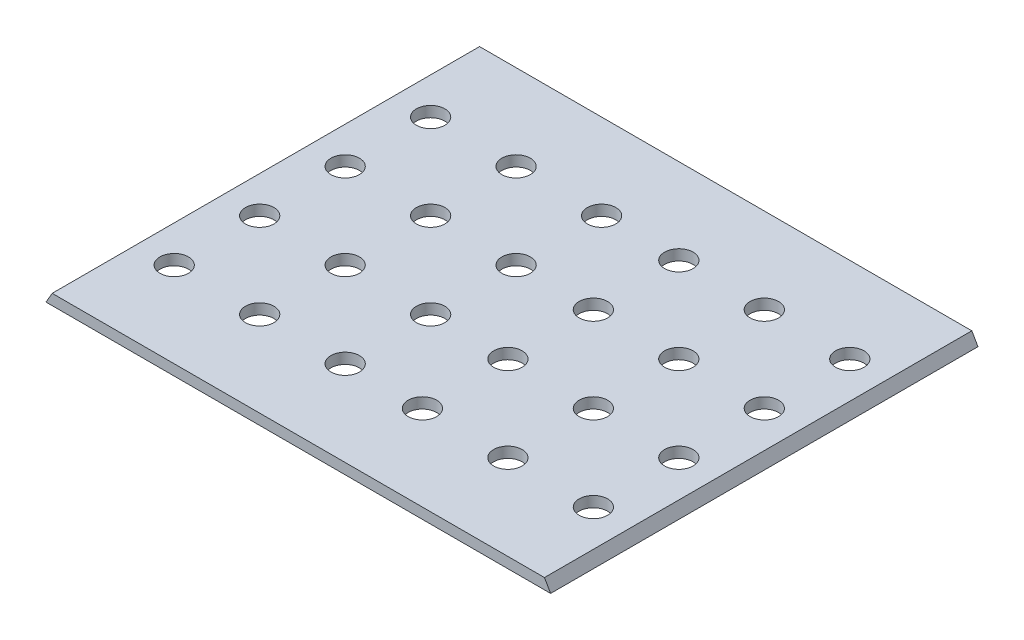
ISO-10303-21;
HEADER;
FILE_DESCRIPTION(('STEP AP214'),'2;1');
FILE_NAME('part.step','',(''),(''),'','','');
FILE_SCHEMA(('AUTOMOTIVE_DESIGN { 1 0 10303 214 1 1 1 1 }'));
ENDSEC;
DATA;
#1=APPLICATION_CONTEXT('core data for automotive mechanical design processes');
#2=APPLICATION_PROTOCOL_DEFINITION('international standard','automotive_design',2000,#1);
#3=PRODUCT_CONTEXT('',#1,'mechanical');
#4=PRODUCT('Part','Part','',(#3));
#5=PRODUCT_RELATED_PRODUCT_CATEGORY('part','',(#4));
#6=PRODUCT_DEFINITION_FORMATION('','',#4);
#7=PRODUCT_DEFINITION_CONTEXT('part definition',#1,'design');
#8=PRODUCT_DEFINITION('design','',#6,#7);
#9=PRODUCT_DEFINITION_SHAPE('','',#8);
#10=(LENGTH_UNIT() NAMED_UNIT(*) SI_UNIT(.MILLI.,.METRE.));
#11=(NAMED_UNIT(*) PLANE_ANGLE_UNIT() SI_UNIT($,.RADIAN.));
#12=(NAMED_UNIT(*) SI_UNIT($,.STERADIAN.) SOLID_ANGLE_UNIT());
#13=UNCERTAINTY_MEASURE_WITH_UNIT(LENGTH_MEASURE(1.E-05),#10,'distance_accuracy_value','');
#14=(GEOMETRIC_REPRESENTATION_CONTEXT(3) GLOBAL_UNCERTAINTY_ASSIGNED_CONTEXT((#13)) GLOBAL_UNIT_ASSIGNED_CONTEXT((#10,
#11,#12)) REPRESENTATION_CONTEXT('',''));
#15=CARTESIAN_POINT('',(0.,0.,0.));
#16=DIRECTION('',(0.,0.,1.));
#17=DIRECTION('',(1.,0.,0.));
#18=AXIS2_PLACEMENT_3D('',#15,#16,#17);
#19=CARTESIAN_POINT('',(0.,7.5,0.));
#20=DIRECTION('',(0.,-1.,0.));
#21=DIRECTION('',(0.,0.,-1.));
#22=AXIS2_PLACEMENT_3D('',#19,#20,#21);
#23=PLANE('',#22);
#24=CARTESIAN_POINT('',(87.1132486540518,7.5,30.));
#25=DIRECTION('',(0.,1.,0.));
#26=DIRECTION('',(0.,0.,1.));
#27=AXIS2_PLACEMENT_3D('',#24,#25,#26);
#28=CIRCLE('',#27,9.99999999999998);
#29=CARTESIAN_POINT('',(87.1132486540518,7.5,40.));
#30=VERTEX_POINT('',#29);
#31=EDGE_CURVE('E316',#30,#30,#28,.T.);
#32=ORIENTED_EDGE('',*,*,#31,.F.);
#33=EDGE_LOOP('',(#32));
#34=FACE_BOUND('',#33,.T.);
#35=CARTESIAN_POINT('',(87.1132486540518,7.5,-30.));
#36=DIRECTION('',(0.,1.,0.));
#37=DIRECTION('',(0.,0.,1.));
#38=AXIS2_PLACEMENT_3D('',#35,#36,#37);
#39=CIRCLE('',#38,9.99999999999998);
#40=CARTESIAN_POINT('',(87.1132486540518,7.5,-20.));
#41=VERTEX_POINT('',#40);
#42=EDGE_CURVE('E322',#41,#41,#39,.T.);
#43=ORIENTED_EDGE('',*,*,#42,.F.);
#44=EDGE_LOOP('',(#43));
#45=FACE_BOUND('',#44,.T.);
#46=CARTESIAN_POINT('',(87.1132486540518,7.5,-90.));
#47=DIRECTION('',(0.,1.,0.));
#48=DIRECTION('',(0.,0.,1.));
#49=AXIS2_PLACEMENT_3D('',#46,#47,#48);
#50=CIRCLE('',#49,9.99999999999998);
#51=CARTESIAN_POINT('',(87.1132486540518,7.5,-80.));
#52=VERTEX_POINT('',#51);
#53=EDGE_CURVE('E328',#52,#52,#50,.T.);
#54=ORIENTED_EDGE('',*,*,#53,.F.);
#55=EDGE_LOOP('',(#54));
#56=FACE_BOUND('',#55,.T.);
#57=CARTESIAN_POINT('',(87.1132486540518,7.5,90.));
#58=DIRECTION('',(0.,1.,0.));
#59=DIRECTION('',(0.,0.,1.));
#60=AXIS2_PLACEMENT_3D('',#57,#58,#59);
#61=CIRCLE('',#60,9.99999999999998);
#62=CARTESIAN_POINT('',(87.1132486540518,7.5,100.));
#63=VERTEX_POINT('',#62);
#64=EDGE_CURVE('E334',#63,#63,#61,.T.);
#65=ORIENTED_EDGE('',*,*,#64,.F.);
#66=EDGE_LOOP('',(#65));
#67=FACE_BOUND('',#66,.T.);
#68=CARTESIAN_POINT('',(147.113248654052,7.5,-30.));
#69=DIRECTION('',(0.,1.,0.));
#70=DIRECTION('',(0.,0.,1.));
#71=AXIS2_PLACEMENT_3D('',#68,#69,#70);
#72=CIRCLE('',#71,9.99999999999998);
#73=CARTESIAN_POINT('',(147.113248654052,7.5,-20.));
#74=VERTEX_POINT('',#73);
#75=EDGE_CURVE('E340',#74,#74,#72,.T.);
#76=ORIENTED_EDGE('',*,*,#75,.F.);
#77=EDGE_LOOP('',(#76));
#78=FACE_BOUND('',#77,.T.);
#79=CARTESIAN_POINT('',(147.113248654052,7.5,-90.));
#80=DIRECTION('',(0.,1.,0.));
#81=DIRECTION('',(0.,0.,1.));
#82=AXIS2_PLACEMENT_3D('',#79,#80,#81);
#83=CIRCLE('',#82,9.99999999999998);
#84=CARTESIAN_POINT('',(147.113248654052,7.5,-80.));
#85=VERTEX_POINT('',#84);
#86=EDGE_CURVE('E343',#85,#85,#83,.T.);
#87=ORIENTED_EDGE('',*,*,#86,.F.);
#88=EDGE_LOOP('',(#87));
#89=FACE_BOUND('',#88,.T.);
#90=DIRECTION('',(-1.,0.,0.));
#91=VECTOR('',#90,1.);
#92=CARTESIAN_POINT('',(0.,7.5,-150.));
#93=LINE('',#92,#91);
#94=CARTESIAN_POINT('',(172.783121635129,7.5,-150.));
#95=VERTEX_POINT('',#94);
#96=CARTESIAN_POINT('',(-172.783121635129,7.5,-150.));
#97=VERTEX_POINT('',#96);
#98=EDGE_CURVE('E81',#95,#97,#93,.T.);
#99=ORIENTED_EDGE('',*,*,#98,.T.);
#100=DIRECTION('',(0.,0.,1.));
#101=VECTOR('',#100,1.);
#102=CARTESIAN_POINT('',(-172.78312163513,7.5,150.));
#103=LINE('',#102,#101);
#104=CARTESIAN_POINT('',(-172.783121635129,7.5,150.));
#105=VERTEX_POINT('',#104);
#106=EDGE_CURVE('E41',#97,#105,#103,.T.);
#107=ORIENTED_EDGE('',*,*,#106,.T.);
#108=DIRECTION('',(1.,0.,0.));
#109=VECTOR('',#108,1.);
#110=CARTESIAN_POINT('',(0.,7.5,150.));
#111=LINE('',#110,#109);
#112=CARTESIAN_POINT('',(172.783121635129,7.5,150.));
#113=VERTEX_POINT('',#112);
#114=EDGE_CURVE('E75',#105,#113,#111,.T.);
#115=ORIENTED_EDGE('',*,*,#114,.T.);
#116=DIRECTION('',(0.,0.,-1.));
#117=VECTOR('',#116,1.);
#118=CARTESIAN_POINT('',(172.78312163513,7.5,0.));
#119=LINE('',#118,#117);
#120=EDGE_CURVE('E79',#113,#95,#119,.T.);
#121=ORIENTED_EDGE('',*,*,#120,.T.);
#122=EDGE_LOOP('',(#99,#107,#115,#121));
#123=FACE_BOUND('',#122,.T.);
#124=CARTESIAN_POINT('',(147.113248654052,7.5,30.));
#125=DIRECTION('',(0.,1.,0.));
#126=DIRECTION('',(0.,0.,1.));
#127=AXIS2_PLACEMENT_3D('',#124,#125,#126);
#128=CIRCLE('',#127,9.99999999999998);
#129=CARTESIAN_POINT('',(147.113248654052,7.5,40.));
#130=VERTEX_POINT('',#129);
#131=EDGE_CURVE('E106',#130,#130,#128,.T.);
#132=ORIENTED_EDGE('',*,*,#131,.F.);
#133=EDGE_LOOP('',(#132));
#134=FACE_BOUND('',#133,.T.);
#135=CARTESIAN_POINT('',(147.113248654052,7.5,90.));
#136=DIRECTION('',(0.,1.,0.));
#137=DIRECTION('',(0.,0.,1.));
#138=AXIS2_PLACEMENT_3D('',#135,#136,#137);
#139=CIRCLE('',#138,9.99999999999998);
#140=CARTESIAN_POINT('',(147.113248654052,7.5,100.));
#141=VERTEX_POINT('',#140);
#142=EDGE_CURVE('E112',#141,#141,#139,.T.);
#143=ORIENTED_EDGE('',*,*,#142,.F.);
#144=EDGE_LOOP('',(#143));
#145=FACE_BOUND('',#144,.T.);
#146=CARTESIAN_POINT('',(27.1132486540518,7.5,90.));
#147=DIRECTION('',(0.,1.,0.));
#148=DIRECTION('',(0.,0.,1.));
#149=AXIS2_PLACEMENT_3D('',#146,#147,#148);
#150=CIRCLE('',#149,9.99999999999998);
#151=CARTESIAN_POINT('',(27.1132486540518,7.5,99.9999999999999));
#152=VERTEX_POINT('',#151);
#153=EDGE_CURVE('E118',#152,#152,#150,.T.);
#154=ORIENTED_EDGE('',*,*,#153,.F.);
#155=EDGE_LOOP('',(#154));
#156=FACE_BOUND('',#155,.T.);
#157=CARTESIAN_POINT('',(27.1132486540518,7.5,-90.));
#158=DIRECTION('',(0.,1.,0.));
#159=DIRECTION('',(0.,0.,1.));
#160=AXIS2_PLACEMENT_3D('',#157,#158,#159);
#161=CIRCLE('',#160,9.99999999999998);
#162=CARTESIAN_POINT('',(27.1132486540518,7.5,-80.));
#163=VERTEX_POINT('',#162);
#164=EDGE_CURVE('E124',#163,#163,#161,.T.);
#165=ORIENTED_EDGE('',*,*,#164,.F.);
#166=EDGE_LOOP('',(#165));
#167=FACE_BOUND('',#166,.T.);
#168=CARTESIAN_POINT('',(27.1132486540518,7.5,-30.));
#169=DIRECTION('',(0.,1.,0.));
#170=DIRECTION('',(0.,0.,1.));
#171=AXIS2_PLACEMENT_3D('',#168,#169,#170);
#172=CIRCLE('',#171,9.99999999999998);
#173=CARTESIAN_POINT('',(27.1132486540518,7.5,-20.0000000000001));
#174=VERTEX_POINT('',#173);
#175=EDGE_CURVE('E130',#174,#174,#172,.T.);
#176=ORIENTED_EDGE('',*,*,#175,.F.);
#177=EDGE_LOOP('',(#176));
#178=FACE_BOUND('',#177,.T.);
#179=CARTESIAN_POINT('',(27.1132486540518,7.5,30.));
#180=DIRECTION('',(0.,1.,0.));
#181=DIRECTION('',(0.,0.,1.));
#182=AXIS2_PLACEMENT_3D('',#179,#180,#181);
#183=CIRCLE('',#182,9.99999999999998);
#184=CARTESIAN_POINT('',(27.1132486540518,7.5,39.9999999999999));
#185=VERTEX_POINT('',#184);
#186=EDGE_CURVE('E136',#185,#185,#183,.T.);
#187=ORIENTED_EDGE('',*,*,#186,.F.);
#188=EDGE_LOOP('',(#187));
#189=FACE_BOUND('',#188,.T.);
#190=CARTESIAN_POINT('',(-147.113248654052,7.5,-90.));
#191=DIRECTION('',(0.,-1.,0.));
#192=DIRECTION('',(0.,0.,1.));
#193=AXIS2_PLACEMENT_3D('',#190,#191,#192);
#194=CIRCLE('',#193,9.99999999999998);
#195=CARTESIAN_POINT('',(-147.113248654052,7.5,-80.));
#196=VERTEX_POINT('',#195);
#197=EDGE_CURVE('E219',#196,#196,#194,.T.);
#198=ORIENTED_EDGE('',*,*,#197,.T.);
#199=EDGE_LOOP('',(#198));
#200=FACE_BOUND('',#199,.T.);
#201=CARTESIAN_POINT('',(-147.113248654052,7.5,-30.));
#202=DIRECTION('',(0.,-1.,0.));
#203=DIRECTION('',(0.,0.,1.));
#204=AXIS2_PLACEMENT_3D('',#201,#202,#203);
#205=CIRCLE('',#204,9.99999999999998);
#206=CARTESIAN_POINT('',(-147.113248654052,7.5,-20.));
#207=VERTEX_POINT('',#206);
#208=EDGE_CURVE('E223',#207,#207,#205,.T.);
#209=ORIENTED_EDGE('',*,*,#208,.T.);
#210=EDGE_LOOP('',(#209));
#211=FACE_BOUND('',#210,.T.);
#212=CARTESIAN_POINT('',(-147.113248654052,7.5,30.));
#213=DIRECTION('',(0.,-1.,0.));
#214=DIRECTION('',(0.,0.,1.));
#215=AXIS2_PLACEMENT_3D('',#212,#213,#214);
#216=CIRCLE('',#215,9.99999999999998);
#217=CARTESIAN_POINT('',(-147.113248654052,7.5,40.));
#218=VERTEX_POINT('',#217);
#219=EDGE_CURVE('E227',#218,#218,#216,.T.);
#220=ORIENTED_EDGE('',*,*,#219,.T.);
#221=EDGE_LOOP('',(#220));
#222=FACE_BOUND('',#221,.T.);
#223=CARTESIAN_POINT('',(-147.113248654052,7.5,90.));
#224=DIRECTION('',(0.,-1.,0.));
#225=DIRECTION('',(0.,0.,1.));
#226=AXIS2_PLACEMENT_3D('',#223,#224,#225);
#227=CIRCLE('',#226,9.99999999999998);
#228=CARTESIAN_POINT('',(-147.113248654052,7.5,100.));
#229=VERTEX_POINT('',#228);
#230=EDGE_CURVE('E231',#229,#229,#227,.T.);
#231=ORIENTED_EDGE('',*,*,#230,.T.);
#232=EDGE_LOOP('',(#231));
#233=FACE_BOUND('',#232,.T.);
#234=CARTESIAN_POINT('',(-87.1132486540518,7.5,-90.));
#235=DIRECTION('',(0.,-1.,0.));
#236=DIRECTION('',(0.,0.,1.));
#237=AXIS2_PLACEMENT_3D('',#234,#235,#236);
#238=CIRCLE('',#237,9.99999999999998);
#239=CARTESIAN_POINT('',(-87.1132486540518,7.5,-80.));
#240=VERTEX_POINT('',#239);
#241=EDGE_CURVE('E235',#240,#240,#238,.T.);
#242=ORIENTED_EDGE('',*,*,#241,.T.);
#243=EDGE_LOOP('',(#242));
#244=FACE_BOUND('',#243,.T.);
#245=CARTESIAN_POINT('',(-87.1132486540518,7.5,-30.));
#246=DIRECTION('',(0.,-1.,0.));
#247=DIRECTION('',(0.,0.,1.));
#248=AXIS2_PLACEMENT_3D('',#245,#246,#247);
#249=CIRCLE('',#248,9.99999999999998);
#250=CARTESIAN_POINT('',(-87.1132486540518,7.5,-20.));
#251=VERTEX_POINT('',#250);
#252=EDGE_CURVE('E239',#251,#251,#249,.T.);
#253=ORIENTED_EDGE('',*,*,#252,.T.);
#254=EDGE_LOOP('',(#253));
#255=FACE_BOUND('',#254,.T.);
#256=CARTESIAN_POINT('',(-87.1132486540518,7.5,30.));
#257=DIRECTION('',(0.,-1.,0.));
#258=DIRECTION('',(0.,0.,1.));
#259=AXIS2_PLACEMENT_3D('',#256,#257,#258);
#260=CIRCLE('',#259,9.99999999999998);
#261=CARTESIAN_POINT('',(-87.1132486540518,7.5,40.));
#262=VERTEX_POINT('',#261);
#263=EDGE_CURVE('E243',#262,#262,#260,.T.);
#264=ORIENTED_EDGE('',*,*,#263,.T.);
#265=EDGE_LOOP('',(#264));
#266=FACE_BOUND('',#265,.T.);
#267=CARTESIAN_POINT('',(-87.1132486540518,7.5,90.));
#268=DIRECTION('',(0.,-1.,0.));
#269=DIRECTION('',(0.,0.,1.));
#270=AXIS2_PLACEMENT_3D('',#267,#268,#269);
#271=CIRCLE('',#270,9.99999999999998);
#272=CARTESIAN_POINT('',(-87.1132486540518,7.5,99.9999999999999));
#273=VERTEX_POINT('',#272);
#274=EDGE_CURVE('E247',#273,#273,#271,.T.);
#275=ORIENTED_EDGE('',*,*,#274,.T.);
#276=EDGE_LOOP('',(#275));
#277=FACE_BOUND('',#276,.T.);
#278=CARTESIAN_POINT('',(-27.1132486540518,7.5,-90.));
#279=DIRECTION('',(0.,-1.,0.));
#280=DIRECTION('',(0.,0.,1.));
#281=AXIS2_PLACEMENT_3D('',#278,#279,#280);
#282=CIRCLE('',#281,9.99999999999998);
#283=CARTESIAN_POINT('',(-27.1132486540518,7.5,-80.0000000000001));
#284=VERTEX_POINT('',#283);
#285=EDGE_CURVE('E251',#284,#284,#282,.T.);
#286=ORIENTED_EDGE('',*,*,#285,.T.);
#287=EDGE_LOOP('',(#286));
#288=FACE_BOUND('',#287,.T.);
#289=CARTESIAN_POINT('',(-27.1132486540518,7.5,-30.));
#290=DIRECTION('',(0.,-1.,0.));
#291=DIRECTION('',(0.,0.,1.));
#292=AXIS2_PLACEMENT_3D('',#289,#290,#291);
#293=CIRCLE('',#292,9.99999999999998);
#294=CARTESIAN_POINT('',(-27.1132486540518,7.5,-20.0000000000001));
#295=VERTEX_POINT('',#294);
#296=EDGE_CURVE('E255',#295,#295,#293,.T.);
#297=ORIENTED_EDGE('',*,*,#296,.T.);
#298=EDGE_LOOP('',(#297));
#299=FACE_BOUND('',#298,.T.);
#300=CARTESIAN_POINT('',(-27.1132486540518,7.5,30.));
#301=DIRECTION('',(0.,-1.,0.));
#302=DIRECTION('',(0.,0.,1.));
#303=AXIS2_PLACEMENT_3D('',#300,#301,#302);
#304=CIRCLE('',#303,9.99999999999998);
#305=CARTESIAN_POINT('',(-27.1132486540518,7.5,39.9999999999999));
#306=VERTEX_POINT('',#305);
#307=EDGE_CURVE('E259',#306,#306,#304,.T.);
#308=ORIENTED_EDGE('',*,*,#307,.T.);
#309=EDGE_LOOP('',(#308));
#310=FACE_BOUND('',#309,.T.);
#311=CARTESIAN_POINT('',(-27.1132486540518,7.5,90.));
#312=DIRECTION('',(0.,-1.,0.));
#313=DIRECTION('',(0.,0.,1.));
#314=AXIS2_PLACEMENT_3D('',#311,#312,#313);
#315=CIRCLE('',#314,9.99999999999998);
#316=CARTESIAN_POINT('',(-27.1132486540518,7.5,99.9999999999999));
#317=VERTEX_POINT('',#316);
#318=EDGE_CURVE('E262',#317,#317,#315,.T.);
#319=ORIENTED_EDGE('',*,*,#318,.T.);
#320=EDGE_LOOP('',(#319));
#321=FACE_BOUND('',#320,.T.);
#322=ADVANCED_FACE('F33',(#34,#45,#56,#67,#78,#89,#123,#134,#145,#156,#167,#178,#189,#200,#211,
#222,#233,#244,#255,#266,#277,#288,#299,#310,#321),#23,.F.);
#323=CARTESIAN_POINT('',(0.,0.,0.));
#324=DIRECTION('',(0.,-1.,0.));
#325=DIRECTION('',(0.,0.,-1.));
#326=AXIS2_PLACEMENT_3D('',#323,#324,#325);
#327=PLANE('',#326);
#328=CARTESIAN_POINT('',(-27.1132486540518,0.,30.));
#329=DIRECTION('',(0.,-1.,0.));
#330=DIRECTION('',(0.,0.,1.));
#331=AXIS2_PLACEMENT_3D('',#328,#329,#330);
#332=CIRCLE('',#331,9.99999999999998);
#333=CARTESIAN_POINT('',(-27.1132486540518,0.,39.9999999999999));
#334=VERTEX_POINT('',#333);
#335=EDGE_CURVE('E269',#334,#334,#332,.T.);
#336=ORIENTED_EDGE('',*,*,#335,.F.);
#337=EDGE_LOOP('',(#336));
#338=FACE_BOUND('',#337,.T.);
#339=CARTESIAN_POINT('',(-27.1132486540518,0.,-90.));
#340=DIRECTION('',(0.,-1.,0.));
#341=DIRECTION('',(0.,0.,1.));
#342=AXIS2_PLACEMENT_3D('',#339,#340,#341);
#343=CIRCLE('',#342,9.99999999999998);
#344=CARTESIAN_POINT('',(-27.1132486540518,0.,-80.0000000000001));
#345=VERTEX_POINT('',#344);
#346=EDGE_CURVE('E277',#345,#345,#343,.T.);
#347=ORIENTED_EDGE('',*,*,#346,.F.);
#348=EDGE_LOOP('',(#347));
#349=FACE_BOUND('',#348,.T.);
#350=CARTESIAN_POINT('',(-87.1132486540518,0.,30.));
#351=DIRECTION('',(0.,-1.,0.));
#352=DIRECTION('',(0.,0.,1.));
#353=AXIS2_PLACEMENT_3D('',#350,#351,#352);
#354=CIRCLE('',#353,9.99999999999998);
#355=CARTESIAN_POINT('',(-87.1132486540518,0.,40.));
#356=VERTEX_POINT('',#355);
#357=EDGE_CURVE('E285',#356,#356,#354,.T.);
#358=ORIENTED_EDGE('',*,*,#357,.F.);
#359=EDGE_LOOP('',(#358));
#360=FACE_BOUND('',#359,.T.);
#361=CARTESIAN_POINT('',(-87.1132486540518,0.,-90.));
#362=DIRECTION('',(0.,-1.,0.));
#363=DIRECTION('',(0.,0.,1.));
#364=AXIS2_PLACEMENT_3D('',#361,#362,#363);
#365=CIRCLE('',#364,9.99999999999998);
#366=CARTESIAN_POINT('',(-87.1132486540518,0.,-80.));
#367=VERTEX_POINT('',#366);
#368=EDGE_CURVE('E293',#367,#367,#365,.T.);
#369=ORIENTED_EDGE('',*,*,#368,.F.);
#370=EDGE_LOOP('',(#369));
#371=FACE_BOUND('',#370,.T.);
#372=CARTESIAN_POINT('',(-147.113248654052,0.,30.));
#373=DIRECTION('',(0.,-1.,0.));
#374=DIRECTION('',(0.,0.,1.));
#375=AXIS2_PLACEMENT_3D('',#372,#373,#374);
#376=CIRCLE('',#375,9.99999999999998);
#377=CARTESIAN_POINT('',(-147.113248654052,0.,40.));
#378=VERTEX_POINT('',#377);
#379=EDGE_CURVE('E301',#378,#378,#376,.T.);
#380=ORIENTED_EDGE('',*,*,#379,.F.);
#381=EDGE_LOOP('',(#380));
#382=FACE_BOUND('',#381,.T.);
#383=CARTESIAN_POINT('',(-147.113248654052,0.,-90.));
#384=DIRECTION('',(0.,-1.,0.));
#385=DIRECTION('',(0.,0.,1.));
#386=AXIS2_PLACEMENT_3D('',#383,#384,#385);
#387=CIRCLE('',#386,9.99999999999998);
#388=CARTESIAN_POINT('',(-147.113248654052,0.,-80.));
#389=VERTEX_POINT('',#388);
#390=EDGE_CURVE('E309',#389,#389,#387,.T.);
#391=ORIENTED_EDGE('',*,*,#390,.F.);
#392=EDGE_LOOP('',(#391));
#393=FACE_BOUND('',#392,.T.);
#394=CARTESIAN_POINT('',(87.1132486540518,0.,30.));
#395=DIRECTION('',(0.,1.,0.));
#396=DIRECTION('',(0.,0.,1.));
#397=AXIS2_PLACEMENT_3D('',#394,#395,#396);
#398=CIRCLE('',#397,9.99999999999998);
#399=CARTESIAN_POINT('',(87.1132486540518,0.,40.));
#400=VERTEX_POINT('',#399);
#401=EDGE_CURVE('E312',#400,#400,#398,.T.);
#402=ORIENTED_EDGE('',*,*,#401,.T.);
#403=EDGE_LOOP('',(#402));
#404=FACE_BOUND('',#403,.T.);
#405=CARTESIAN_POINT('',(87.1132486540518,0.,-30.));
#406=DIRECTION('',(0.,1.,0.));
#407=DIRECTION('',(0.,0.,1.));
#408=AXIS2_PLACEMENT_3D('',#405,#406,#407);
#409=CIRCLE('',#408,9.99999999999998);
#410=CARTESIAN_POINT('',(87.1132486540518,0.,-20.));
#411=VERTEX_POINT('',#410);
#412=EDGE_CURVE('E319',#411,#411,#409,.T.);
#413=ORIENTED_EDGE('',*,*,#412,.T.);
#414=EDGE_LOOP('',(#413));
#415=FACE_BOUND('',#414,.T.);
#416=CARTESIAN_POINT('',(87.1132486540518,0.,-90.));
#417=DIRECTION('',(0.,1.,0.));
#418=DIRECTION('',(0.,0.,1.));
#419=AXIS2_PLACEMENT_3D('',#416,#417,#418);
#420=CIRCLE('',#419,9.99999999999998);
#421=CARTESIAN_POINT('',(87.1132486540518,0.,-80.));
#422=VERTEX_POINT('',#421);
#423=EDGE_CURVE('E325',#422,#422,#420,.T.);
#424=ORIENTED_EDGE('',*,*,#423,.T.);
#425=EDGE_LOOP('',(#424));
#426=FACE_BOUND('',#425,.T.);
#427=CARTESIAN_POINT('',(87.1132486540518,0.,90.));
#428=DIRECTION('',(0.,1.,0.));
#429=DIRECTION('',(0.,0.,1.));
#430=AXIS2_PLACEMENT_3D('',#427,#428,#429);
#431=CIRCLE('',#430,9.99999999999998);
#432=CARTESIAN_POINT('',(87.1132486540518,0.,100.));
#433=VERTEX_POINT('',#432);
#434=EDGE_CURVE('E331',#433,#433,#431,.T.);
#435=ORIENTED_EDGE('',*,*,#434,.T.);
#436=EDGE_LOOP('',(#435));
#437=FACE_BOUND('',#436,.T.);
#438=CARTESIAN_POINT('',(147.113248654052,0.,-30.));
#439=DIRECTION('',(0.,1.,0.));
#440=DIRECTION('',(0.,0.,1.));
#441=AXIS2_PLACEMENT_3D('',#438,#439,#440);
#442=CIRCLE('',#441,9.99999999999998);
#443=CARTESIAN_POINT('',(147.113248654052,0.,-20.));
#444=VERTEX_POINT('',#443);
#445=EDGE_CURVE('E337',#444,#444,#442,.T.);
#446=ORIENTED_EDGE('',*,*,#445,.T.);
#447=EDGE_LOOP('',(#446));
#448=FACE_BOUND('',#447,.T.);
#449=CARTESIAN_POINT('',(147.113248654052,0.,-90.));
#450=DIRECTION('',(0.,1.,0.));
#451=DIRECTION('',(0.,0.,1.));
#452=AXIS2_PLACEMENT_3D('',#449,#450,#451);
#453=CIRCLE('',#452,9.99999999999998);
#454=CARTESIAN_POINT('',(147.113248654052,0.,-80.));
#455=VERTEX_POINT('',#454);
#456=EDGE_CURVE('E344',#455,#455,#453,.T.);
#457=ORIENTED_EDGE('',*,*,#456,.T.);
#458=EDGE_LOOP('',(#457));
#459=FACE_BOUND('',#458,.T.);
#460=DIRECTION('',(1.,0.,0.));
#461=VECTOR('',#460,1.);
#462=CARTESIAN_POINT('',(0.,0.,150.));
#463=LINE('',#462,#461);
#464=CARTESIAN_POINT('',(-177.113248654052,0.,150.));
#465=VERTEX_POINT('',#464);
#466=CARTESIAN_POINT('',(177.113248654052,0.,150.));
#467=VERTEX_POINT('',#466);
#468=EDGE_CURVE('E88',#465,#467,#463,.T.);
#469=ORIENTED_EDGE('',*,*,#468,.F.);
#470=DIRECTION('',(0.,0.,-1.));
#471=VECTOR('',#470,1.);
#472=CARTESIAN_POINT('',(-177.113248654052,0.,0.));
#473=LINE('',#472,#471);
#474=CARTESIAN_POINT('',(-177.113248654052,0.,-150.));
#475=VERTEX_POINT('',#474);
#476=EDGE_CURVE('E139',#465,#475,#473,.T.);
#477=ORIENTED_EDGE('',*,*,#476,.T.);
#478=DIRECTION('',(-1.,0.,0.));
#479=VECTOR('',#478,1.);
#480=CARTESIAN_POINT('',(0.,0.,-150.));
#481=LINE('',#480,#479);
#482=CARTESIAN_POINT('',(177.113248654052,0.,-150.));
#483=VERTEX_POINT('',#482);
#484=EDGE_CURVE('E82',#483,#475,#481,.T.);
#485=ORIENTED_EDGE('',*,*,#484,.F.);
#486=DIRECTION('',(0.,0.,-1.));
#487=VECTOR('',#486,1.);
#488=CARTESIAN_POINT('',(177.113248654052,0.,0.));
#489=LINE('',#488,#487);
#490=EDGE_CURVE('E93',#483,#467,#489,.F.);
#491=ORIENTED_EDGE('',*,*,#490,.T.);
#492=EDGE_LOOP('',(#469,#477,#485,#491));
#493=FACE_BOUND('',#492,.T.);
#494=CARTESIAN_POINT('',(147.113248654052,0.,30.));
#495=DIRECTION('',(0.,1.,0.));
#496=DIRECTION('',(0.,0.,1.));
#497=AXIS2_PLACEMENT_3D('',#494,#495,#496);
#498=CIRCLE('',#497,9.99999999999998);
#499=CARTESIAN_POINT('',(147.113248654052,0.,40.));
#500=VERTEX_POINT('',#499);
#501=EDGE_CURVE('E92',#500,#500,#498,.T.);
#502=ORIENTED_EDGE('',*,*,#501,.T.);
#503=EDGE_LOOP('',(#502));
#504=FACE_BOUND('',#503,.T.);
#505=CARTESIAN_POINT('',(147.113248654052,0.,90.));
#506=DIRECTION('',(0.,1.,0.));
#507=DIRECTION('',(0.,0.,1.));
#508=AXIS2_PLACEMENT_3D('',#505,#506,#507);
#509=CIRCLE('',#508,9.99999999999998);
#510=CARTESIAN_POINT('',(147.113248654052,0.,100.));
#511=VERTEX_POINT('',#510);
#512=EDGE_CURVE('E109',#511,#511,#509,.T.);
#513=ORIENTED_EDGE('',*,*,#512,.T.);
#514=EDGE_LOOP('',(#513));
#515=FACE_BOUND('',#514,.T.);
#516=CARTESIAN_POINT('',(27.1132486540518,0.,90.));
#517=DIRECTION('',(0.,1.,0.));
#518=DIRECTION('',(0.,0.,1.));
#519=AXIS2_PLACEMENT_3D('',#516,#517,#518);
#520=CIRCLE('',#519,9.99999999999998);
#521=CARTESIAN_POINT('',(27.1132486540518,0.,99.9999999999999));
#522=VERTEX_POINT('',#521);
#523=EDGE_CURVE('E115',#522,#522,#520,.T.);
#524=ORIENTED_EDGE('',*,*,#523,.T.);
#525=EDGE_LOOP('',(#524));
#526=FACE_BOUND('',#525,.T.);
#527=CARTESIAN_POINT('',(27.1132486540518,0.,-90.));
#528=DIRECTION('',(0.,1.,0.));
#529=DIRECTION('',(0.,0.,1.));
#530=AXIS2_PLACEMENT_3D('',#527,#528,#529);
#531=CIRCLE('',#530,9.99999999999998);
#532=CARTESIAN_POINT('',(27.1132486540518,0.,-80.));
#533=VERTEX_POINT('',#532);
#534=EDGE_CURVE('E121',#533,#533,#531,.T.);
#535=ORIENTED_EDGE('',*,*,#534,.T.);
#536=EDGE_LOOP('',(#535));
#537=FACE_BOUND('',#536,.T.);
#538=CARTESIAN_POINT('',(27.1132486540518,0.,-30.));
#539=DIRECTION('',(0.,1.,0.));
#540=DIRECTION('',(0.,0.,1.));
#541=AXIS2_PLACEMENT_3D('',#538,#539,#540);
#542=CIRCLE('',#541,9.99999999999998);
#543=CARTESIAN_POINT('',(27.1132486540518,0.,-20.0000000000001));
#544=VERTEX_POINT('',#543);
#545=EDGE_CURVE('E127',#544,#544,#542,.T.);
#546=ORIENTED_EDGE('',*,*,#545,.T.);
#547=EDGE_LOOP('',(#546));
#548=FACE_BOUND('',#547,.T.);
#549=CARTESIAN_POINT('',(27.1132486540518,0.,30.));
#550=DIRECTION('',(0.,1.,0.));
#551=DIRECTION('',(0.,0.,1.));
#552=AXIS2_PLACEMENT_3D('',#549,#550,#551);
#553=CIRCLE('',#552,9.99999999999998);
#554=CARTESIAN_POINT('',(27.1132486540518,0.,39.9999999999999));
#555=VERTEX_POINT('',#554);
#556=EDGE_CURVE('E133',#555,#555,#553,.T.);
#557=ORIENTED_EDGE('',*,*,#556,.T.);
#558=EDGE_LOOP('',(#557));
#559=FACE_BOUND('',#558,.T.);
#560=CARTESIAN_POINT('',(-147.113248654052,0.,-30.));
#561=DIRECTION('',(0.,-1.,0.));
#562=DIRECTION('',(0.,0.,1.));
#563=AXIS2_PLACEMENT_3D('',#560,#561,#562);
#564=CIRCLE('',#563,9.99999999999998);
#565=CARTESIAN_POINT('',(-147.113248654052,0.,-20.));
#566=VERTEX_POINT('',#565);
#567=EDGE_CURVE('E305',#566,#566,#564,.T.);
#568=ORIENTED_EDGE('',*,*,#567,.F.);
#569=EDGE_LOOP('',(#568));
#570=FACE_BOUND('',#569,.T.);
#571=CARTESIAN_POINT('',(-147.113248654052,0.,90.));
#572=DIRECTION('',(0.,-1.,0.));
#573=DIRECTION('',(0.,0.,1.));
#574=AXIS2_PLACEMENT_3D('',#571,#572,#573);
#575=CIRCLE('',#574,9.99999999999998);
#576=CARTESIAN_POINT('',(-147.113248654052,0.,100.));
#577=VERTEX_POINT('',#576);
#578=EDGE_CURVE('E297',#577,#577,#575,.T.);
#579=ORIENTED_EDGE('',*,*,#578,.F.);
#580=EDGE_LOOP('',(#579));
#581=FACE_BOUND('',#580,.T.);
#582=CARTESIAN_POINT('',(-87.1132486540518,0.,-30.));
#583=DIRECTION('',(0.,-1.,0.));
#584=DIRECTION('',(0.,0.,1.));
#585=AXIS2_PLACEMENT_3D('',#582,#583,#584);
#586=CIRCLE('',#585,9.99999999999998);
#587=CARTESIAN_POINT('',(-87.1132486540518,0.,-20.));
#588=VERTEX_POINT('',#587);
#589=EDGE_CURVE('E289',#588,#588,#586,.T.);
#590=ORIENTED_EDGE('',*,*,#589,.F.);
#591=EDGE_LOOP('',(#590));
#592=FACE_BOUND('',#591,.T.);
#593=CARTESIAN_POINT('',(-87.1132486540518,0.,90.));
#594=DIRECTION('',(0.,-1.,0.));
#595=DIRECTION('',(0.,0.,1.));
#596=AXIS2_PLACEMENT_3D('',#593,#594,#595);
#597=CIRCLE('',#596,9.99999999999998);
#598=CARTESIAN_POINT('',(-87.1132486540518,0.,99.9999999999999));
#599=VERTEX_POINT('',#598);
#600=EDGE_CURVE('E281',#599,#599,#597,.T.);
#601=ORIENTED_EDGE('',*,*,#600,.F.);
#602=EDGE_LOOP('',(#601));
#603=FACE_BOUND('',#602,.T.);
#604=CARTESIAN_POINT('',(-27.1132486540518,0.,-30.));
#605=DIRECTION('',(0.,-1.,0.));
#606=DIRECTION('',(0.,0.,1.));
#607=AXIS2_PLACEMENT_3D('',#604,#605,#606);
#608=CIRCLE('',#607,9.99999999999998);
#609=CARTESIAN_POINT('',(-27.1132486540518,0.,-20.0000000000001));
#610=VERTEX_POINT('',#609);
#611=EDGE_CURVE('E273',#610,#610,#608,.T.);
#612=ORIENTED_EDGE('',*,*,#611,.F.);
#613=EDGE_LOOP('',(#612));
#614=FACE_BOUND('',#613,.T.);
#615=CARTESIAN_POINT('',(-27.1132486540518,0.,90.));
#616=DIRECTION('',(0.,-1.,0.));
#617=DIRECTION('',(0.,0.,1.));
#618=AXIS2_PLACEMENT_3D('',#615,#616,#617);
#619=CIRCLE('',#618,9.99999999999998);
#620=CARTESIAN_POINT('',(-27.1132486540518,0.,99.9999999999999));
#621=VERTEX_POINT('',#620);
#622=EDGE_CURVE('E264',#621,#621,#619,.T.);
#623=ORIENTED_EDGE('',*,*,#622,.F.);
#624=EDGE_LOOP('',(#623));
#625=FACE_BOUND('',#624,.T.);
#626=ADVANCED_FACE('F143',(#338,#349,#360,#371,#382,#393,#404,#415,#426,#437,#448,#459,#493,
#504,#515,#526,#537,#548,#559,#570,#581,#592,#603,#614,#625),#327,.T.);
#627=CARTESIAN_POINT('',(0.,7.5,150.));
#628=DIRECTION('',(0.,0.,-1.));
#629=DIRECTION('',(-1.,0.,0.));
#630=AXIS2_PLACEMENT_3D('',#627,#628,#629);
#631=PLANE('',#630);
#632=ORIENTED_EDGE('',*,*,#114,.F.);
#633=DIRECTION('',(-0.500000000000005,-0.866025403784436,0.));
#634=VECTOR('',#633,1.);
#635=CARTESIAN_POINT('',(-180.,-5.00000000000005,150.));
#636=LINE('',#635,#634);
#637=EDGE_CURVE('E11',#105,#465,#636,.T.);
#638=ORIENTED_EDGE('',*,*,#637,.T.);
#639=ORIENTED_EDGE('',*,*,#468,.T.);
#640=DIRECTION('',(0.500000000000005,-0.866025403784436,0.));
#641=VECTOR('',#640,1.);
#642=CARTESIAN_POINT('',(172.78312163513,7.5,150.));
#643=LINE('',#642,#641);
#644=EDGE_CURVE('E85',#467,#113,#643,.F.);
#645=ORIENTED_EDGE('',*,*,#644,.T.);
#646=EDGE_LOOP('',(#632,#638,#639,#645));
#647=FACE_BOUND('',#646,.T.);
#648=ADVANCED_FACE('F86',(#647),#631,.F.);
#649=CARTESIAN_POINT('',(0.,7.5,-150.));
#650=DIRECTION('',(0.,0.,1.));
#651=DIRECTION('',(1.,0.,0.));
#652=AXIS2_PLACEMENT_3D('',#649,#650,#651);
#653=PLANE('',#652);
#654=ORIENTED_EDGE('',*,*,#484,.T.);
#655=DIRECTION('',(0.500000000000005,0.866025403784436,0.));
#656=VECTOR('',#655,1.);
#657=CARTESIAN_POINT('',(-180.,-5.00000000000001,-150.));
#658=LINE('',#657,#656);
#659=EDGE_CURVE('E54',#475,#97,#658,.T.);
#660=ORIENTED_EDGE('',*,*,#659,.T.);
#661=ORIENTED_EDGE('',*,*,#98,.F.);
#662=DIRECTION('',(-0.500000000000005,0.866025403784436,0.));
#663=VECTOR('',#662,1.);
#664=CARTESIAN_POINT('',(172.78312163513,7.49999999999998,-150.));
#665=LINE('',#664,#663);
#666=EDGE_CURVE('E96',#95,#483,#665,.F.);
#667=ORIENTED_EDGE('',*,*,#666,.T.);
#668=EDGE_LOOP('',(#654,#660,#661,#667));
#669=FACE_BOUND('',#668,.T.);
#670=ADVANCED_FACE('F145',(#669),#653,.F.);
#671=CARTESIAN_POINT('',(172.78312163513,7.5,0.));
#672=DIRECTION('',(-0.866025403784436,-0.500000000000005,0.));
#673=DIRECTION('',(0.,0.,-1.));
#674=AXIS2_PLACEMENT_3D('',#671,#672,#673);
#675=PLANE('',#674);
#676=ORIENTED_EDGE('',*,*,#644,.F.);
#677=ORIENTED_EDGE('',*,*,#490,.F.);
#678=ORIENTED_EDGE('',*,*,#666,.F.);
#679=ORIENTED_EDGE('',*,*,#120,.F.);
#680=EDGE_LOOP('',(#676,#677,#678,#679));
#681=FACE_BOUND('',#680,.T.);
#682=ADVANCED_FACE('F95',(#681),#675,.F.);
#683=CARTESIAN_POINT('',(147.113248654052,0.,-90.));
#684=DIRECTION('',(0.,1.,0.));
#685=DIRECTION('',(0.,0.,1.));
#686=AXIS2_PLACEMENT_3D('',#683,#684,#685);
#687=CYLINDRICAL_SURFACE('',#686,9.99999999999998);
#688=ORIENTED_EDGE('',*,*,#456,.F.);
#689=EDGE_LOOP('',(#688));
#690=FACE_BOUND('',#689,.T.);
#691=ORIENTED_EDGE('',*,*,#86,.T.);
#692=EDGE_LOOP('',(#691));
#693=FACE_BOUND('',#692,.T.);
#694=ADVANCED_FACE('F169',(#690,#693),#687,.F.);
#695=CARTESIAN_POINT('',(147.113248654052,0.,-30.));
#696=DIRECTION('',(0.,1.,0.));
#697=DIRECTION('',(0.,0.,1.));
#698=AXIS2_PLACEMENT_3D('',#695,#696,#697);
#699=CYLINDRICAL_SURFACE('',#698,9.99999999999998);
#700=ORIENTED_EDGE('',*,*,#445,.F.);
#701=EDGE_LOOP('',(#700));
#702=FACE_BOUND('',#701,.T.);
#703=ORIENTED_EDGE('',*,*,#75,.T.);
#704=EDGE_LOOP('',(#703));
#705=FACE_BOUND('',#704,.T.);
#706=ADVANCED_FACE('F182',(#702,#705),#699,.F.);
#707=CARTESIAN_POINT('',(147.113248654052,0.,30.));
#708=DIRECTION('',(0.,1.,0.));
#709=DIRECTION('',(0.,0.,1.));
#710=AXIS2_PLACEMENT_3D('',#707,#708,#709);
#711=CYLINDRICAL_SURFACE('',#710,9.99999999999998);
#712=ORIENTED_EDGE('',*,*,#501,.F.);
#713=EDGE_LOOP('',(#712));
#714=FACE_BOUND('',#713,.T.);
#715=ORIENTED_EDGE('',*,*,#131,.T.);
#716=EDGE_LOOP('',(#715));
#717=FACE_BOUND('',#716,.T.);
#718=ADVANCED_FACE('F178',(#714,#717),#711,.F.);
#719=CARTESIAN_POINT('',(147.113248654052,0.,90.));
#720=DIRECTION('',(0.,1.,0.));
#721=DIRECTION('',(0.,0.,1.));
#722=AXIS2_PLACEMENT_3D('',#719,#720,#721);
#723=CYLINDRICAL_SURFACE('',#722,9.99999999999998);
#724=ORIENTED_EDGE('',*,*,#512,.F.);
#725=EDGE_LOOP('',(#724));
#726=FACE_BOUND('',#725,.T.);
#727=ORIENTED_EDGE('',*,*,#142,.T.);
#728=EDGE_LOOP('',(#727));
#729=FACE_BOUND('',#728,.T.);
#730=ADVANCED_FACE('F181',(#726,#729),#723,.F.);
#731=CARTESIAN_POINT('',(87.1132486540518,0.,90.));
#732=DIRECTION('',(0.,1.,0.));
#733=DIRECTION('',(0.,0.,1.));
#734=AXIS2_PLACEMENT_3D('',#731,#732,#733);
#735=CYLINDRICAL_SURFACE('',#734,9.99999999999998);
#736=ORIENTED_EDGE('',*,*,#434,.F.);
#737=EDGE_LOOP('',(#736));
#738=FACE_BOUND('',#737,.T.);
#739=ORIENTED_EDGE('',*,*,#64,.T.);
#740=EDGE_LOOP('',(#739));
#741=FACE_BOUND('',#740,.T.);
#742=ADVANCED_FACE('F186',(#738,#741),#735,.F.);
#743=CARTESIAN_POINT('',(27.1132486540518,0.,90.));
#744=DIRECTION('',(0.,1.,0.));
#745=DIRECTION('',(0.,0.,1.));
#746=AXIS2_PLACEMENT_3D('',#743,#744,#745);
#747=CYLINDRICAL_SURFACE('',#746,9.99999999999998);
#748=ORIENTED_EDGE('',*,*,#523,.F.);
#749=EDGE_LOOP('',(#748));
#750=FACE_BOUND('',#749,.T.);
#751=ORIENTED_EDGE('',*,*,#153,.T.);
#752=EDGE_LOOP('',(#751));
#753=FACE_BOUND('',#752,.T.);
#754=ADVANCED_FACE('F188',(#750,#753),#747,.F.);
#755=CARTESIAN_POINT('',(87.1132486540518,0.,-90.));
#756=DIRECTION('',(0.,1.,0.));
#757=DIRECTION('',(0.,0.,1.));
#758=AXIS2_PLACEMENT_3D('',#755,#756,#757);
#759=CYLINDRICAL_SURFACE('',#758,9.99999999999998);
#760=ORIENTED_EDGE('',*,*,#423,.F.);
#761=EDGE_LOOP('',(#760));
#762=FACE_BOUND('',#761,.T.);
#763=ORIENTED_EDGE('',*,*,#53,.T.);
#764=EDGE_LOOP('',(#763));
#765=FACE_BOUND('',#764,.T.);
#766=ADVANCED_FACE('F191',(#762,#765),#759,.F.);
#767=CARTESIAN_POINT('',(27.1132486540518,0.,-90.));
#768=DIRECTION('',(0.,1.,0.));
#769=DIRECTION('',(0.,0.,1.));
#770=AXIS2_PLACEMENT_3D('',#767,#768,#769);
#771=CYLINDRICAL_SURFACE('',#770,9.99999999999998);
#772=ORIENTED_EDGE('',*,*,#534,.F.);
#773=EDGE_LOOP('',(#772));
#774=FACE_BOUND('',#773,.T.);
#775=ORIENTED_EDGE('',*,*,#164,.T.);
#776=EDGE_LOOP('',(#775));
#777=FACE_BOUND('',#776,.T.);
#778=ADVANCED_FACE('F193',(#774,#777),#771,.F.);
#779=CARTESIAN_POINT('',(87.1132486540518,0.,-30.));
#780=DIRECTION('',(0.,1.,0.));
#781=DIRECTION('',(0.,0.,1.));
#782=AXIS2_PLACEMENT_3D('',#779,#780,#781);
#783=CYLINDRICAL_SURFACE('',#782,9.99999999999998);
#784=ORIENTED_EDGE('',*,*,#412,.F.);
#785=EDGE_LOOP('',(#784));
#786=FACE_BOUND('',#785,.T.);
#787=ORIENTED_EDGE('',*,*,#42,.T.);
#788=EDGE_LOOP('',(#787));
#789=FACE_BOUND('',#788,.T.);
#790=ADVANCED_FACE('F196',(#786,#789),#783,.F.);
#791=CARTESIAN_POINT('',(27.1132486540518,0.,-30.));
#792=DIRECTION('',(0.,1.,0.));
#793=DIRECTION('',(0.,0.,1.));
#794=AXIS2_PLACEMENT_3D('',#791,#792,#793);
#795=CYLINDRICAL_SURFACE('',#794,9.99999999999998);
#796=ORIENTED_EDGE('',*,*,#545,.F.);
#797=EDGE_LOOP('',(#796));
#798=FACE_BOUND('',#797,.T.);
#799=ORIENTED_EDGE('',*,*,#175,.T.);
#800=EDGE_LOOP('',(#799));
#801=FACE_BOUND('',#800,.T.);
#802=ADVANCED_FACE('F198',(#798,#801),#795,.F.);
#803=CARTESIAN_POINT('',(87.1132486540518,0.,30.));
#804=DIRECTION('',(0.,1.,0.));
#805=DIRECTION('',(0.,0.,1.));
#806=AXIS2_PLACEMENT_3D('',#803,#804,#805);
#807=CYLINDRICAL_SURFACE('',#806,9.99999999999998);
#808=ORIENTED_EDGE('',*,*,#401,.F.);
#809=EDGE_LOOP('',(#808));
#810=FACE_BOUND('',#809,.T.);
#811=ORIENTED_EDGE('',*,*,#31,.T.);
#812=EDGE_LOOP('',(#811));
#813=FACE_BOUND('',#812,.T.);
#814=ADVANCED_FACE('F156',(#810,#813),#807,.F.);
#815=CARTESIAN_POINT('',(27.1132486540518,0.,30.));
#816=DIRECTION('',(0.,1.,0.));
#817=DIRECTION('',(0.,0.,1.));
#818=AXIS2_PLACEMENT_3D('',#815,#816,#817);
#819=CYLINDRICAL_SURFACE('',#818,9.99999999999998);
#820=ORIENTED_EDGE('',*,*,#556,.F.);
#821=EDGE_LOOP('',(#820));
#822=FACE_BOUND('',#821,.T.);
#823=ORIENTED_EDGE('',*,*,#186,.T.);
#824=EDGE_LOOP('',(#823));
#825=FACE_BOUND('',#824,.T.);
#826=ADVANCED_FACE('F148',(#822,#825),#819,.F.);
#827=CARTESIAN_POINT('',(-180.,-5.00000000000005,150.));
#828=DIRECTION('',(-0.866025403784436,0.500000000000005,0.));
#829=DIRECTION('',(0.,0.,1.));
#830=AXIS2_PLACEMENT_3D('',#827,#828,#829);
#831=PLANE('',#830);
#832=ORIENTED_EDGE('',*,*,#637,.F.);
#833=ORIENTED_EDGE('',*,*,#106,.F.);
#834=ORIENTED_EDGE('',*,*,#659,.F.);
#835=ORIENTED_EDGE('',*,*,#476,.F.);
#836=EDGE_LOOP('',(#832,#833,#834,#835));
#837=FACE_BOUND('',#836,.T.);
#838=ADVANCED_FACE('F35',(#837),#831,.T.);
#839=CARTESIAN_POINT('',(-147.113248654052,0.,-90.));
#840=DIRECTION('',(0.,1.,0.));
#841=DIRECTION('',(0.,0.,1.));
#842=AXIS2_PLACEMENT_3D('',#839,#840,#841);
#843=CYLINDRICAL_SURFACE('',#842,9.99999999999998);
#844=ORIENTED_EDGE('',*,*,#390,.T.);
#845=EDGE_LOOP('',(#844));
#846=FACE_BOUND('',#845,.T.);
#847=ORIENTED_EDGE('',*,*,#197,.F.);
#848=EDGE_LOOP('',(#847));
#849=FACE_BOUND('',#848,.T.);
#850=ADVANCED_FACE('F147',(#846,#849),#843,.F.);
#851=CARTESIAN_POINT('',(-147.113248654052,0.,-30.));
#852=DIRECTION('',(0.,1.,0.));
#853=DIRECTION('',(0.,0.,1.));
#854=AXIS2_PLACEMENT_3D('',#851,#852,#853);
#855=CYLINDRICAL_SURFACE('',#854,9.99999999999998);
#856=ORIENTED_EDGE('',*,*,#567,.T.);
#857=EDGE_LOOP('',(#856));
#858=FACE_BOUND('',#857,.T.);
#859=ORIENTED_EDGE('',*,*,#208,.F.);
#860=EDGE_LOOP('',(#859));
#861=FACE_BOUND('',#860,.T.);
#862=ADVANCED_FACE('F153',(#858,#861),#855,.F.);
#863=CARTESIAN_POINT('',(-147.113248654052,0.,30.));
#864=DIRECTION('',(0.,1.,0.));
#865=DIRECTION('',(0.,0.,1.));
#866=AXIS2_PLACEMENT_3D('',#863,#864,#865);
#867=CYLINDRICAL_SURFACE('',#866,9.99999999999998);
#868=ORIENTED_EDGE('',*,*,#379,.T.);
#869=EDGE_LOOP('',(#868));
#870=FACE_BOUND('',#869,.T.);
#871=ORIENTED_EDGE('',*,*,#219,.F.);
#872=EDGE_LOOP('',(#871));
#873=FACE_BOUND('',#872,.T.);
#874=ADVANCED_FACE('F372',(#870,#873),#867,.F.);
#875=CARTESIAN_POINT('',(-147.113248654052,0.,90.));
#876=DIRECTION('',(0.,1.,0.));
#877=DIRECTION('',(0.,0.,1.));
#878=AXIS2_PLACEMENT_3D('',#875,#876,#877);
#879=CYLINDRICAL_SURFACE('',#878,9.99999999999998);
#880=ORIENTED_EDGE('',*,*,#578,.T.);
#881=EDGE_LOOP('',(#880));
#882=FACE_BOUND('',#881,.T.);
#883=ORIENTED_EDGE('',*,*,#230,.F.);
#884=EDGE_LOOP('',(#883));
#885=FACE_BOUND('',#884,.T.);
#886=ADVANCED_FACE('F376',(#882,#885),#879,.F.);
#887=CARTESIAN_POINT('',(-87.1132486540518,0.,-90.));
#888=DIRECTION('',(0.,1.,0.));
#889=DIRECTION('',(0.,0.,1.));
#890=AXIS2_PLACEMENT_3D('',#887,#888,#889);
#891=CYLINDRICAL_SURFACE('',#890,9.99999999999998);
#892=ORIENTED_EDGE('',*,*,#368,.T.);
#893=EDGE_LOOP('',(#892));
#894=FACE_BOUND('',#893,.T.);
#895=ORIENTED_EDGE('',*,*,#241,.F.);
#896=EDGE_LOOP('',(#895));
#897=FACE_BOUND('',#896,.T.);
#898=ADVANCED_FACE('F380',(#894,#897),#891,.F.);
#899=CARTESIAN_POINT('',(-87.1132486540518,0.,-30.));
#900=DIRECTION('',(0.,1.,0.));
#901=DIRECTION('',(0.,0.,1.));
#902=AXIS2_PLACEMENT_3D('',#899,#900,#901);
#903=CYLINDRICAL_SURFACE('',#902,9.99999999999998);
#904=ORIENTED_EDGE('',*,*,#589,.T.);
#905=EDGE_LOOP('',(#904));
#906=FACE_BOUND('',#905,.T.);
#907=ORIENTED_EDGE('',*,*,#252,.F.);
#908=EDGE_LOOP('',(#907));
#909=FACE_BOUND('',#908,.T.);
#910=ADVANCED_FACE('F384',(#906,#909),#903,.F.);
#911=CARTESIAN_POINT('',(-87.1132486540518,0.,30.));
#912=DIRECTION('',(0.,1.,0.));
#913=DIRECTION('',(0.,0.,1.));
#914=AXIS2_PLACEMENT_3D('',#911,#912,#913);
#915=CYLINDRICAL_SURFACE('',#914,9.99999999999998);
#916=ORIENTED_EDGE('',*,*,#357,.T.);
#917=EDGE_LOOP('',(#916));
#918=FACE_BOUND('',#917,.T.);
#919=ORIENTED_EDGE('',*,*,#263,.F.);
#920=EDGE_LOOP('',(#919));
#921=FACE_BOUND('',#920,.T.);
#922=ADVANCED_FACE('F388',(#918,#921),#915,.F.);
#923=CARTESIAN_POINT('',(-87.1132486540518,0.,90.));
#924=DIRECTION('',(0.,1.,0.));
#925=DIRECTION('',(0.,0.,1.));
#926=AXIS2_PLACEMENT_3D('',#923,#924,#925);
#927=CYLINDRICAL_SURFACE('',#926,9.99999999999998);
#928=ORIENTED_EDGE('',*,*,#600,.T.);
#929=EDGE_LOOP('',(#928));
#930=FACE_BOUND('',#929,.T.);
#931=ORIENTED_EDGE('',*,*,#274,.F.);
#932=EDGE_LOOP('',(#931));
#933=FACE_BOUND('',#932,.T.);
#934=ADVANCED_FACE('F392',(#930,#933),#927,.F.);
#935=CARTESIAN_POINT('',(-27.1132486540518,0.,-90.));
#936=DIRECTION('',(0.,1.,0.));
#937=DIRECTION('',(0.,0.,1.));
#938=AXIS2_PLACEMENT_3D('',#935,#936,#937);
#939=CYLINDRICAL_SURFACE('',#938,9.99999999999998);
#940=ORIENTED_EDGE('',*,*,#346,.T.);
#941=EDGE_LOOP('',(#940));
#942=FACE_BOUND('',#941,.T.);
#943=ORIENTED_EDGE('',*,*,#285,.F.);
#944=EDGE_LOOP('',(#943));
#945=FACE_BOUND('',#944,.T.);
#946=ADVANCED_FACE('F396',(#942,#945),#939,.F.);
#947=CARTESIAN_POINT('',(-27.1132486540518,0.,-30.));
#948=DIRECTION('',(0.,1.,0.));
#949=DIRECTION('',(0.,0.,1.));
#950=AXIS2_PLACEMENT_3D('',#947,#948,#949);
#951=CYLINDRICAL_SURFACE('',#950,9.99999999999998);
#952=ORIENTED_EDGE('',*,*,#611,.T.);
#953=EDGE_LOOP('',(#952));
#954=FACE_BOUND('',#953,.T.);
#955=ORIENTED_EDGE('',*,*,#296,.F.);
#956=EDGE_LOOP('',(#955));
#957=FACE_BOUND('',#956,.T.);
#958=ADVANCED_FACE('F400',(#954,#957),#951,.F.);
#959=CARTESIAN_POINT('',(-27.1132486540518,0.,30.));
#960=DIRECTION('',(0.,1.,0.));
#961=DIRECTION('',(0.,0.,1.));
#962=AXIS2_PLACEMENT_3D('',#959,#960,#961);
#963=CYLINDRICAL_SURFACE('',#962,9.99999999999998);
#964=ORIENTED_EDGE('',*,*,#335,.T.);
#965=EDGE_LOOP('',(#964));
#966=FACE_BOUND('',#965,.T.);
#967=ORIENTED_EDGE('',*,*,#307,.F.);
#968=EDGE_LOOP('',(#967));
#969=FACE_BOUND('',#968,.T.);
#970=ADVANCED_FACE('F404',(#966,#969),#963,.F.);
#971=CARTESIAN_POINT('',(-27.1132486540518,0.,90.));
#972=DIRECTION('',(0.,1.,0.));
#973=DIRECTION('',(0.,0.,1.));
#974=AXIS2_PLACEMENT_3D('',#971,#972,#973);
#975=CYLINDRICAL_SURFACE('',#974,9.99999999999998);
#976=ORIENTED_EDGE('',*,*,#622,.T.);
#977=EDGE_LOOP('',(#976));
#978=FACE_BOUND('',#977,.T.);
#979=ORIENTED_EDGE('',*,*,#318,.F.);
#980=EDGE_LOOP('',(#979));
#981=FACE_BOUND('',#980,.T.);
#982=ADVANCED_FACE('F408',(#978,#981),#975,.F.);
#983=CLOSED_SHELL('',(#322,#626,#648,#670,#682,#694,#706,#718,#730,#742,#754,#766,#778,#790,
#802,#814,#826,#838,#850,#862,#874,#886,#898,#910,#922,#934,#946,#958,#970,#982));
#984=MANIFOLD_SOLID_BREP('B2',#983);
#985=ADVANCED_BREP_SHAPE_REPRESENTATION('',(#18,#984),#14);
#986=SHAPE_DEFINITION_REPRESENTATION(#9,#985);
ENDSEC;
END-ISO-10303-21;
